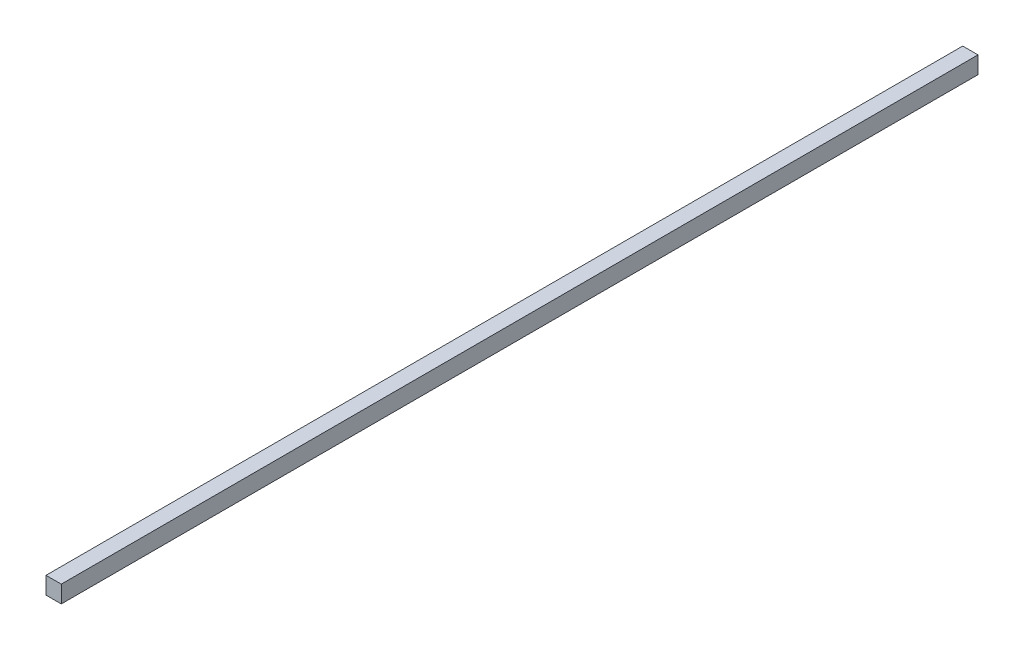
ISO-10303-21;
HEADER;
FILE_DESCRIPTION(('STEP AP214'),'2;1');
FILE_NAME('part.step','',(''),(''),'','','');
FILE_SCHEMA(('AUTOMOTIVE_DESIGN { 1 0 10303 214 1 1 1 1 }'));
ENDSEC;
DATA;
#1=APPLICATION_CONTEXT('core data for automotive mechanical design processes');
#2=APPLICATION_PROTOCOL_DEFINITION('international standard','automotive_design',2000,#1);
#3=PRODUCT_CONTEXT('',#1,'mechanical');
#4=PRODUCT('Part','Part','',(#3));
#5=PRODUCT_RELATED_PRODUCT_CATEGORY('part','',(#4));
#6=PRODUCT_DEFINITION_FORMATION('','',#4);
#7=PRODUCT_DEFINITION_CONTEXT('part definition',#1,'design');
#8=PRODUCT_DEFINITION('design','',#6,#7);
#9=PRODUCT_DEFINITION_SHAPE('','',#8);
#10=(LENGTH_UNIT() NAMED_UNIT(*) SI_UNIT(.MILLI.,.METRE.));
#11=(NAMED_UNIT(*) PLANE_ANGLE_UNIT() SI_UNIT($,.RADIAN.));
#12=(NAMED_UNIT(*) SI_UNIT($,.STERADIAN.) SOLID_ANGLE_UNIT());
#13=UNCERTAINTY_MEASURE_WITH_UNIT(LENGTH_MEASURE(1.E-05),#10,'distance_accuracy_value','');
#14=(GEOMETRIC_REPRESENTATION_CONTEXT(3) GLOBAL_UNCERTAINTY_ASSIGNED_CONTEXT((#13)) GLOBAL_UNIT_ASSIGNED_CONTEXT((#10,
#11,#12)) REPRESENTATION_CONTEXT('',''));
#15=CARTESIAN_POINT('',(0.,0.,0.));
#16=DIRECTION('',(0.,0.,1.));
#17=DIRECTION('',(1.,0.,0.));
#18=AXIS2_PLACEMENT_3D('',#15,#16,#17);
#19=CARTESIAN_POINT('',(0.,0.,24.00000026));
#20=DIRECTION('',(0.,0.,1.));
#21=DIRECTION('',(1.,0.,0.));
#22=AXIS2_PLACEMENT_3D('',#19,#20,#21);
#23=PLANE('',#22);
#24=DIRECTION('',(1.,0.,0.));
#25=VECTOR('',#24,1.);
#26=CARTESIAN_POINT('',(-0.1999996,-0.22500082,24.00000026));
#27=LINE('',#26,#25);
#28=CARTESIAN_POINT('',(-0.1999996,-0.22500082,24.00000026));
#29=VERTEX_POINT('',#28);
#30=CARTESIAN_POINT('',(0.1999996,-0.22500082,24.00000026));
#31=VERTEX_POINT('',#30);
#32=EDGE_CURVE('E83',#29,#31,#27,.T.);
#33=ORIENTED_EDGE('',*,*,#32,.T.);
#34=DIRECTION('',(0.,1.,0.));
#35=VECTOR('',#34,1.);
#36=CARTESIAN_POINT('',(0.1999996,-0.22500082,24.00000026));
#37=LINE('',#36,#35);
#38=CARTESIAN_POINT('',(0.1999996,0.22500082,24.00000026));
#39=VERTEX_POINT('',#38);
#40=EDGE_CURVE('E107',#31,#39,#37,.T.);
#41=ORIENTED_EDGE('',*,*,#40,.T.);
#42=DIRECTION('',(-1.,0.,0.));
#43=VECTOR('',#42,1.);
#44=CARTESIAN_POINT('',(0.1999996,0.22500082,24.00000026));
#45=LINE('',#44,#43);
#46=CARTESIAN_POINT('',(-0.1999996,0.22500082,24.00000026));
#47=VERTEX_POINT('',#46);
#48=EDGE_CURVE('E20',#39,#47,#45,.T.);
#49=ORIENTED_EDGE('',*,*,#48,.T.);
#50=DIRECTION('',(0.,-1.,0.));
#51=VECTOR('',#50,1.);
#52=CARTESIAN_POINT('',(-0.1999996,0.22500082,24.00000026));
#53=LINE('',#52,#51);
#54=EDGE_CURVE('E11',#47,#29,#53,.T.);
#55=ORIENTED_EDGE('',*,*,#54,.T.);
#56=EDGE_LOOP('',(#33,#41,#49,#55));
#57=FACE_BOUND('',#56,.T.);
#58=ADVANCED_FACE('F17',(#57),#23,.T.);
#59=CARTESIAN_POINT('',(0.,0.,0.));
#60=DIRECTION('',(0.,0.,1.));
#61=DIRECTION('',(1.,0.,0.));
#62=AXIS2_PLACEMENT_3D('',#59,#60,#61);
#63=PLANE('',#62);
#64=DIRECTION('',(0.,-1.,0.));
#65=VECTOR('',#64,1.);
#66=CARTESIAN_POINT('',(-0.1999996,0.22500082,0.));
#67=LINE('',#66,#65);
#68=CARTESIAN_POINT('',(-0.1999996,0.22500082,0.));
#69=VERTEX_POINT('',#68);
#70=CARTESIAN_POINT('',(-0.1999996,-0.22500082,0.));
#71=VERTEX_POINT('',#70);
#72=EDGE_CURVE('E26',#69,#71,#67,.T.);
#73=ORIENTED_EDGE('',*,*,#72,.F.);
#74=DIRECTION('',(-1.,0.,0.));
#75=VECTOR('',#74,1.);
#76=CARTESIAN_POINT('',(0.1999996,0.22500082,0.));
#77=LINE('',#76,#75);
#78=CARTESIAN_POINT('',(0.1999996,0.22500082,0.));
#79=VERTEX_POINT('',#78);
#80=EDGE_CURVE('E108',#79,#69,#77,.T.);
#81=ORIENTED_EDGE('',*,*,#80,.F.);
#82=DIRECTION('',(0.,1.,0.));
#83=VECTOR('',#82,1.);
#84=CARTESIAN_POINT('',(0.1999996,-0.22500082,0.));
#85=LINE('',#84,#83);
#86=CARTESIAN_POINT('',(0.1999996,-0.22500082,0.));
#87=VERTEX_POINT('',#86);
#88=EDGE_CURVE('E85',#87,#79,#85,.T.);
#89=ORIENTED_EDGE('',*,*,#88,.F.);
#90=DIRECTION('',(1.,0.,0.));
#91=VECTOR('',#90,1.);
#92=CARTESIAN_POINT('',(-0.1999996,-0.22500082,0.));
#93=LINE('',#92,#91);
#94=EDGE_CURVE('E81',#71,#87,#93,.T.);
#95=ORIENTED_EDGE('',*,*,#94,.F.);
#96=EDGE_LOOP('',(#73,#81,#89,#95));
#97=FACE_BOUND('',#96,.T.);
#98=ADVANCED_FACE('F87',(#97),#63,.F.);
#99=CARTESIAN_POINT('',(-0.1999996,0.22500082,0.));
#100=DIRECTION('',(1.,0.,0.));
#101=DIRECTION('',(0.,1.,0.));
#102=AXIS2_PLACEMENT_3D('',#99,#100,#101);
#103=PLANE('',#102);
#104=ORIENTED_EDGE('',*,*,#72,.T.);
#105=DIRECTION('',(0.,0.,1.));
#106=VECTOR('',#105,1.);
#107=CARTESIAN_POINT('',(-0.1999996,-0.22500082,0.));
#108=LINE('',#107,#106);
#109=EDGE_CURVE('E70',#71,#29,#108,.T.);
#110=ORIENTED_EDGE('',*,*,#109,.T.);
#111=ORIENTED_EDGE('',*,*,#54,.F.);
#112=DIRECTION('',(0.,0.,1.));
#113=VECTOR('',#112,1.);
#114=CARTESIAN_POINT('',(-0.1999996,0.22500082,0.));
#115=LINE('',#114,#113);
#116=EDGE_CURVE('E73',#69,#47,#115,.T.);
#117=ORIENTED_EDGE('',*,*,#116,.F.);
#118=EDGE_LOOP('',(#104,#110,#111,#117));
#119=FACE_BOUND('',#118,.T.);
#120=ADVANCED_FACE('F69',(#119),#103,.F.);
#121=CARTESIAN_POINT('',(0.1999996,0.22500082,0.));
#122=DIRECTION('',(0.,-1.,0.));
#123=DIRECTION('',(0.,0.,-1.));
#124=AXIS2_PLACEMENT_3D('',#121,#122,#123);
#125=PLANE('',#124);
#126=ORIENTED_EDGE('',*,*,#80,.T.);
#127=ORIENTED_EDGE('',*,*,#116,.T.);
#128=ORIENTED_EDGE('',*,*,#48,.F.);
#129=DIRECTION('',(0.,0.,1.));
#130=VECTOR('',#129,1.);
#131=CARTESIAN_POINT('',(0.1999996,0.22500082,0.));
#132=LINE('',#131,#130);
#133=EDGE_CURVE('E103',#79,#39,#132,.T.);
#134=ORIENTED_EDGE('',*,*,#133,.F.);
#135=EDGE_LOOP('',(#126,#127,#128,#134));
#136=FACE_BOUND('',#135,.T.);
#137=ADVANCED_FACE('F122',(#136),#125,.F.);
#138=CARTESIAN_POINT('',(0.1999996,-0.22500082,0.));
#139=DIRECTION('',(-1.,0.,0.));
#140=DIRECTION('',(0.,0.,1.));
#141=AXIS2_PLACEMENT_3D('',#138,#139,#140);
#142=PLANE('',#141);
#143=ORIENTED_EDGE('',*,*,#88,.T.);
#144=ORIENTED_EDGE('',*,*,#133,.T.);
#145=ORIENTED_EDGE('',*,*,#40,.F.);
#146=DIRECTION('',(0.,0.,1.));
#147=VECTOR('',#146,1.);
#148=CARTESIAN_POINT('',(0.1999996,-0.22500082,0.));
#149=LINE('',#148,#147);
#150=EDGE_CURVE('E91',#87,#31,#149,.T.);
#151=ORIENTED_EDGE('',*,*,#150,.F.);
#152=EDGE_LOOP('',(#143,#144,#145,#151));
#153=FACE_BOUND('',#152,.T.);
#154=ADVANCED_FACE('F124',(#153),#142,.F.);
#155=CARTESIAN_POINT('',(-0.1999996,-0.22500082,0.));
#156=DIRECTION('',(0.,1.,0.));
#157=DIRECTION('',(1.,0.,0.));
#158=AXIS2_PLACEMENT_3D('',#155,#156,#157);
#159=PLANE('',#158);
#160=ORIENTED_EDGE('',*,*,#94,.T.);
#161=ORIENTED_EDGE('',*,*,#150,.T.);
#162=ORIENTED_EDGE('',*,*,#32,.F.);
#163=ORIENTED_EDGE('',*,*,#109,.F.);
#164=EDGE_LOOP('',(#160,#161,#162,#163));
#165=FACE_BOUND('',#164,.T.);
#166=ADVANCED_FACE('F79',(#165),#159,.F.);
#167=CLOSED_SHELL('',(#58,#98,#120,#137,#154,#166));
#168=MANIFOLD_SOLID_BREP('B1',#167);
#169=ADVANCED_BREP_SHAPE_REPRESENTATION('',(#18,#168),#14);
#170=SHAPE_DEFINITION_REPRESENTATION(#9,#169);
ENDSEC;
END-ISO-10303-21;
